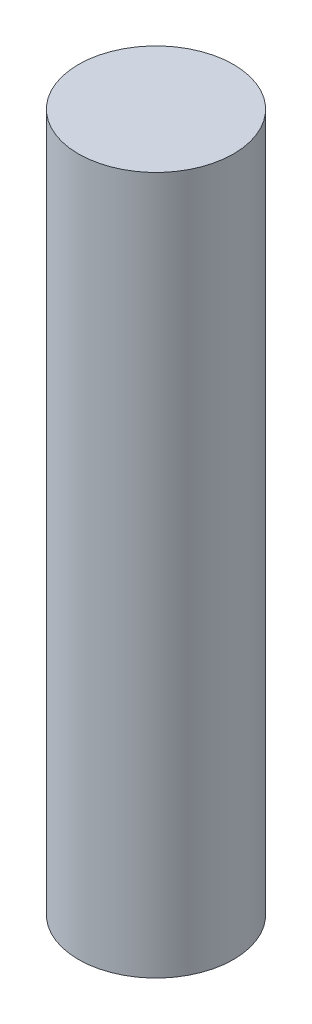
ISO-10303-21;
HEADER;
FILE_DESCRIPTION(('STEP AP214'),'2;1');
FILE_NAME('part.step','',(''),(''),'','','');
FILE_SCHEMA(('AUTOMOTIVE_DESIGN { 1 0 10303 214 1 1 1 1 }'));
ENDSEC;
DATA;
#1=APPLICATION_CONTEXT('core data for automotive mechanical design processes');
#2=APPLICATION_PROTOCOL_DEFINITION('international standard','automotive_design',2000,#1);
#3=PRODUCT_CONTEXT('',#1,'mechanical');
#4=PRODUCT('Part','Part','',(#3));
#5=PRODUCT_RELATED_PRODUCT_CATEGORY('part','',(#4));
#6=PRODUCT_DEFINITION_FORMATION('','',#4);
#7=PRODUCT_DEFINITION_CONTEXT('part definition',#1,'design');
#8=PRODUCT_DEFINITION('design','',#6,#7);
#9=PRODUCT_DEFINITION_SHAPE('','',#8);
#10=(LENGTH_UNIT() NAMED_UNIT(*) SI_UNIT(.MILLI.,.METRE.));
#11=(NAMED_UNIT(*) PLANE_ANGLE_UNIT() SI_UNIT($,.RADIAN.));
#12=(NAMED_UNIT(*) SI_UNIT($,.STERADIAN.) SOLID_ANGLE_UNIT());
#13=UNCERTAINTY_MEASURE_WITH_UNIT(LENGTH_MEASURE(1.E-05),#10,'distance_accuracy_value','');
#14=(GEOMETRIC_REPRESENTATION_CONTEXT(3) GLOBAL_UNCERTAINTY_ASSIGNED_CONTEXT((#13)) GLOBAL_UNIT_ASSIGNED_CONTEXT((#10,
#11,#12)) REPRESENTATION_CONTEXT('',''));
#15=CARTESIAN_POINT('',(0.,0.,0.));
#16=DIRECTION('',(0.,0.,1.));
#17=DIRECTION('',(1.,0.,0.));
#18=AXIS2_PLACEMENT_3D('',#15,#16,#17);
#19=CARTESIAN_POINT('',(0.,28.575,0.));
#20=DIRECTION('',(0.,-1.,0.));
#21=DIRECTION('',(0.,0.,-1.));
#22=AXIS2_PLACEMENT_3D('',#19,#20,#21);
#23=CYLINDRICAL_SURFACE('',#22,3.175);
#24=CARTESIAN_POINT('',(0.,28.575,0.));
#25=DIRECTION('',(0.,1.,0.));
#26=DIRECTION('',(0.,0.,1.));
#27=AXIS2_PLACEMENT_3D('',#24,#25,#26);
#28=CIRCLE('',#27,3.175);
#29=CARTESIAN_POINT('',(0.,28.575,3.175));
#30=VERTEX_POINT('',#29);
#31=EDGE_CURVE('E10',#30,#30,#28,.T.);
#32=ORIENTED_EDGE('',*,*,#31,.F.);
#33=EDGE_LOOP('',(#32));
#34=FACE_BOUND('',#33,.T.);
#35=CARTESIAN_POINT('',(0.,0.,0.));
#36=DIRECTION('',(0.,1.,0.));
#37=DIRECTION('',(0.,0.,1.));
#38=AXIS2_PLACEMENT_3D('',#35,#36,#37);
#39=CIRCLE('',#38,3.175);
#40=CARTESIAN_POINT('',(0.,0.,3.175));
#41=VERTEX_POINT('',#40);
#42=EDGE_CURVE('E33',#41,#41,#39,.T.);
#43=ORIENTED_EDGE('',*,*,#42,.T.);
#44=EDGE_LOOP('',(#43));
#45=FACE_BOUND('',#44,.T.);
#46=ADVANCED_FACE('F30',(#34,#45),#23,.T.);
#47=CARTESIAN_POINT('',(0.,28.575,0.));
#48=DIRECTION('',(0.,1.,0.));
#49=DIRECTION('',(0.,0.,1.));
#50=AXIS2_PLACEMENT_3D('',#47,#48,#49);
#51=PLANE('',#50);
#52=ORIENTED_EDGE('',*,*,#31,.T.);
#53=EDGE_LOOP('',(#52));
#54=FACE_BOUND('',#53,.T.);
#55=ADVANCED_FACE('F45',(#54),#51,.T.);
#56=CARTESIAN_POINT('',(0.,0.,0.));
#57=DIRECTION('',(0.,1.,0.));
#58=DIRECTION('',(0.,0.,1.));
#59=AXIS2_PLACEMENT_3D('',#56,#57,#58);
#60=PLANE('',#59);
#61=ORIENTED_EDGE('',*,*,#42,.F.);
#62=EDGE_LOOP('',(#61));
#63=FACE_BOUND('',#62,.T.);
#64=ADVANCED_FACE('F43',(#63),#60,.F.);
#65=CLOSED_SHELL('',(#46,#55,#64));
#66=MANIFOLD_SOLID_BREP('B2',#65);
#67=ADVANCED_BREP_SHAPE_REPRESENTATION('',(#18,#66),#14);
#68=SHAPE_DEFINITION_REPRESENTATION(#9,#67);
ENDSEC;
END-ISO-10303-21;
